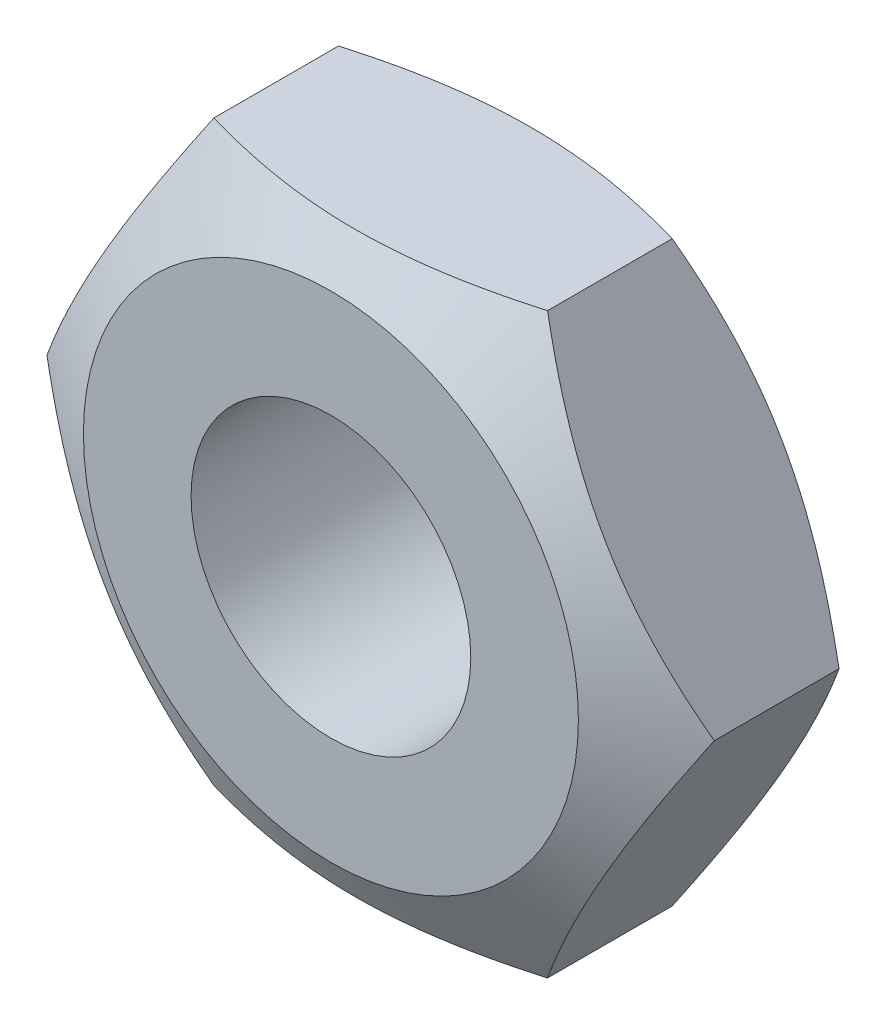
ISO-10303-21;
HEADER;
FILE_DESCRIPTION(('STEP AP214'),'2;1');
FILE_NAME('part.step','',(''),(''),'','','');
FILE_SCHEMA(('AUTOMOTIVE_DESIGN { 1 0 10303 214 1 1 1 1 }'));
ENDSEC;
DATA;
#1=APPLICATION_CONTEXT('core data for automotive mechanical design processes');
#2=APPLICATION_PROTOCOL_DEFINITION('international standard','automotive_design',2000,#1);
#3=PRODUCT_CONTEXT('',#1,'mechanical');
#4=PRODUCT('Part','Part','',(#3));
#5=PRODUCT_RELATED_PRODUCT_CATEGORY('part','',(#4));
#6=PRODUCT_DEFINITION_FORMATION('','',#4);
#7=PRODUCT_DEFINITION_CONTEXT('part definition',#1,'design');
#8=PRODUCT_DEFINITION('design','',#6,#7);
#9=PRODUCT_DEFINITION_SHAPE('','',#8);
#10=(LENGTH_UNIT() NAMED_UNIT(*) SI_UNIT(.MILLI.,.METRE.));
#11=(NAMED_UNIT(*) PLANE_ANGLE_UNIT() SI_UNIT($,.RADIAN.));
#12=(NAMED_UNIT(*) SI_UNIT($,.STERADIAN.) SOLID_ANGLE_UNIT());
#13=UNCERTAINTY_MEASURE_WITH_UNIT(LENGTH_MEASURE(1.E-05),#10,'distance_accuracy_value','');
#14=(GEOMETRIC_REPRESENTATION_CONTEXT(3) GLOBAL_UNCERTAINTY_ASSIGNED_CONTEXT((#13)) GLOBAL_UNIT_ASSIGNED_CONTEXT((#10,
#11,#12)) REPRESENTATION_CONTEXT('',''));
#15=CARTESIAN_POINT('',(0.,0.,0.));
#16=DIRECTION('',(0.,0.,1.));
#17=DIRECTION('',(1.,0.,0.));
#18=AXIS2_PLACEMENT_3D('',#15,#16,#17);
#19=CARTESIAN_POINT('',(4.12159222626818,7.13740000000002,5.5372));
#20=DIRECTION('',(-8.53645842069185E-05,-0.999999996356444,0.));
#21=DIRECTION('',(0.999999996356444,-8.53645842069185E-05,0.));
#22=AXIS2_PLACEMENT_3D('',#19,#20,#21);
#23=PLANE('',#22);
#24=DIRECTION('',(0.,0.,-1.));
#25=VECTOR('',#24,1.);
#26=CARTESIAN_POINT('',(-4.12037360383698,7.13810357198872,5.5372));
#27=LINE('',#26,#25);
#28=CARTESIAN_POINT('',(-4.12037360383698,7.13810357198872,4.30788823694096));
#29=VERTEX_POINT('',#28);
#30=CARTESIAN_POINT('',(-4.12037360383698,7.13810357198872,1.22931176305904));
#31=VERTEX_POINT('',#30);
#32=EDGE_CURVE('E12',#29,#31,#27,.T.);
#33=ORIENTED_EDGE('',*,*,#32,.F.);
#34=CARTESIAN_POINT('',(-4.12057360383698,7.13810358906163,4.30783050086309));
#35=CARTESIAN_POINT('',(-3.93940618814811,7.13808812378047,4.36012084239552));
#36=CARTESIAN_POINT('',(-3.75756329305724,7.13807260083728,4.41003802381626));
#37=CARTESIAN_POINT('',(-3.39240074747005,7.13804142888829,4.50447245527827));
#38=CARTESIAN_POINT('',(-3.20908049601503,7.13802577983119,4.54898737586447));
#39=CARTESIAN_POINT('',(-2.65618459196072,7.13797858210206,4.67355497423284));
#40=CARTESIAN_POINT('',(-2.28442648345868,7.13794684712559,4.74440745196884));
#41=CARTESIAN_POINT('',(-1.72809724572004,7.13789935631135,4.82749006275644));
#42=CARTESIAN_POINT('',(-1.54518834059672,7.13788374236866,4.85115784031085));
#43=CARTESIAN_POINT('',(-1.17854408079075,7.13785244393376,4.89084512282695));
#44=CARTESIAN_POINT('',(-0.99480880057728,7.1378367594479,4.9068653035479));
#45=CARTESIAN_POINT('',(-0.627019148887235,7.1378053632371,4.93084911357203));
#46=CARTESIAN_POINT('',(-0.442965378062387,7.13778965156342,4.93882188592092));
#47=CARTESIAN_POINT('',(-0.0746980003543589,7.13775821457173,4.94654847654521));
#48=CARTESIAN_POINT('',(0.109515601414909,7.13774248925415,4.94630254874227));
#49=CARTESIAN_POINT('',(0.614195268587605,7.13769940748405,4.9343318324784));
#50=CARTESIAN_POINT('',(0.934496113069487,7.13767206513554,4.91423785959537));
#51=CARTESIAN_POINT('',(1.57297040082365,7.13761756204324,4.85052091865647));
#52=CARTESIAN_POINT('',(1.89114159885032,7.13759040149112,4.80687617461222));
#53=CARTESIAN_POINT('',(2.53090070928881,7.13753578872046,4.69777745894697));
#54=CARTESIAN_POINT('',(2.85240790026281,7.13750834339269,4.63186126866467));
#55=CARTESIAN_POINT('',(3.49062782922432,7.13745386201362,4.48225829582427));
#56=CARTESIAN_POINT('',(3.80734874006775,7.13742682526466,4.39860665211493));
#57=CARTESIAN_POINT('',(4.12179222626818,7.1373999829271,4.30783050086309));
#58=B_SPLINE_CURVE_WITH_KNOTS('',3,(#34,#35,#36,#37,#38,#39,#40,#41,#42,#43,#44,#45,#46,#47,#48,
#49,#50,#51,#52,#53,#54,#55,#56,#57),.UNSPECIFIED.,.F.,.F.,(4,2,2,2,2,2,2,2,2,2,2,4),(0.,
0.565643092643378,1.13152923045879,2.26565285271858,2.81882514336941,3.37194854539139,
3.92444280767717,4.47692000033753,5.438702412708,6.40137565540389,7.38539910774354,
8.36749085782236),.UNSPECIFIED.);
#59=CARTESIAN_POINT('',(4.12159222626818,7.13740000000002,4.30788823694096));
#60=VERTEX_POINT('',#59);
#61=EDGE_CURVE('E90',#29,#60,#58,.T.);
#62=ORIENTED_EDGE('',*,*,#61,.T.);
#63=DIRECTION('',(0.,0.,-1.));
#64=VECTOR('',#63,1.);
#65=CARTESIAN_POINT('',(4.12159222626818,7.13740000000002,5.5372));
#66=LINE('',#65,#64);
#67=CARTESIAN_POINT('',(4.12159222626818,7.13740000000002,1.22931176305904));
#68=VERTEX_POINT('',#67);
#69=EDGE_CURVE('E60',#60,#68,#66,.T.);
#70=ORIENTED_EDGE('',*,*,#69,.T.);
#71=CARTESIAN_POINT('',(-4.12057360383698,7.13810358906163,1.22936949913691));
#72=CARTESIAN_POINT('',(-3.93940618814811,7.13808812378047,1.17707915760448));
#73=CARTESIAN_POINT('',(-3.75756329305724,7.13807260083728,1.12716197618374));
#74=CARTESIAN_POINT('',(-3.39240074747005,7.13804142888829,1.03272754472173));
#75=CARTESIAN_POINT('',(-3.20908049601503,7.13802577983119,0.988212624135528));
#76=CARTESIAN_POINT('',(-2.65618459196072,7.13797858210206,0.863645025767163));
#77=CARTESIAN_POINT('',(-2.28442648345868,7.13794684712559,0.792792548031163));
#78=CARTESIAN_POINT('',(-1.72809724572004,7.13789935631135,0.709709937243557));
#79=CARTESIAN_POINT('',(-1.54518834059672,7.13788374236866,0.686042159689147));
#80=CARTESIAN_POINT('',(-1.17854408079075,7.13785244393376,0.646354877173052));
#81=CARTESIAN_POINT('',(-0.99480880057728,7.1378367594479,0.630334696452105));
#82=CARTESIAN_POINT('',(-0.627019148887236,7.1378053632371,0.606350886427972));
#83=CARTESIAN_POINT('',(-0.442965378062388,7.13778965156342,0.598378114079084));
#84=CARTESIAN_POINT('',(-0.0746980003543593,7.13775821457173,0.590651523454793));
#85=CARTESIAN_POINT('',(0.109515601414909,7.13774248925415,0.590897451257725));
#86=CARTESIAN_POINT('',(0.614195268587605,7.13769940748405,0.602868167521598));
#87=CARTESIAN_POINT('',(0.934496113069487,7.13767206513554,0.622962140404627));
#88=CARTESIAN_POINT('',(1.57297040082365,7.13761756204324,0.686679081343524));
#89=CARTESIAN_POINT('',(1.89114159885032,7.13759040149112,0.730323825387775));
#90=CARTESIAN_POINT('',(2.53090070928881,7.13753578872046,0.839422541053031));
#91=CARTESIAN_POINT('',(2.85240790026281,7.13750834339269,0.905338731335329));
#92=CARTESIAN_POINT('',(3.49062782922432,7.13745386201362,1.05494170417573));
#93=CARTESIAN_POINT('',(3.80734874006775,7.13742682526466,1.13859334788507));
#94=CARTESIAN_POINT('',(4.12179222626818,7.1373999829271,1.22936949913691));
#95=B_SPLINE_CURVE_WITH_KNOTS('',3,(#71,#72,#73,#74,#75,#76,#77,#78,#79,#80,#81,#82,#83,#84,#85,
#86,#87,#88,#89,#90,#91,#92,#93,#94),.UNSPECIFIED.,.F.,.F.,(4,2,2,2,2,2,2,2,2,2,2,4),(0.,
0.565643092643377,1.13152923045879,2.26565285271858,2.81882514336941,3.37194854539139,
3.92444280767717,4.47692000033753,5.438702412708,6.40137565540389,7.38539910774354,
8.36749085782236),.UNSPECIFIED.);
#96=EDGE_CURVE('E105',#31,#68,#95,.T.);
#97=ORIENTED_EDGE('',*,*,#96,.F.);
#98=EDGE_LOOP('',(#33,#62,#70,#97));
#99=FACE_BOUND('',#98,.T.);
#100=ADVANCED_FACE('F37',(#99),#23,.F.);
#101=CARTESIAN_POINT('',(-4.12037360383698,7.13810357198872,5.5372));
#102=DIRECTION('',(0.865982718336923,-0.500073926076728,0.));
#103=DIRECTION('',(0.500073926076728,0.865982718336923,0.));
#104=AXIS2_PLACEMENT_3D('',#101,#102,#103);
#105=PLANE('',#104);
#106=DIRECTION('',(0.,0.,-1.));
#107=VECTOR('',#106,1.);
#108=CARTESIAN_POINT('',(-8.24196583010516,0.000703571988696326,5.5372));
#109=LINE('',#108,#107);
#110=CARTESIAN_POINT('',(-8.24196583010516,0.000703571988696322,4.30788823694096));
#111=VERTEX_POINT('',#110);
#112=CARTESIAN_POINT('',(-8.24196583010516,0.000703571988696415,1.22931176305904));
#113=VERTEX_POINT('',#112);
#114=EDGE_CURVE('E45',#111,#113,#109,.T.);
#115=ORIENTED_EDGE('',*,*,#114,.F.);
#116=CARTESIAN_POINT('',(-8.24208132292401,0.000503571988696059,4.30782156558708));
#117=CARTESIAN_POINT('',(-8.15148409142813,0.157391649357806,4.36011227679419));
#118=CARTESIAN_POINT('',(-8.06054906965497,0.314864681325208,4.41002983682875));
#119=CARTESIAN_POINT('',(-7.87794053652239,0.631089594618148,4.50446504195507));
#120=CARTESIAN_POINT('',(-7.78626672463784,0.789841996365864,4.54898035759713));
#121=CARTESIAN_POINT('',(-7.50977748185588,1.26864101701007,4.67354916871746));
#122=CARTESIAN_POINT('',(-7.32387065552509,1.59057761563735,4.74440248507118));
#123=CARTESIAN_POINT('',(-7.04566447336461,2.07234987634206,4.82748634545603));
#124=CARTESIAN_POINT('',(-6.95419636407978,2.23074606096429,4.85115453172131));
#125=CARTESIAN_POINT('',(-6.77084685159904,2.54825413515942,4.89084262777208));
#126=CARTESIAN_POINT('',(-6.6789654856441,2.70736596024178,4.90686321332019));
#127=CARTESIAN_POINT('',(-6.49504317751791,3.02586595004025,4.93084781862488));
#128=CARTESIAN_POINT('',(-6.40300253573183,3.18525359457655,4.93882098158994));
#129=CARTESIAN_POINT('',(-6.21884131371931,3.50416731379769,4.94654833008856));
#130=CARTESIAN_POINT('',(-6.12672073605035,3.66369338405374,4.94630276953199));
#131=CARTESIAN_POINT('',(-5.87434113951377,4.10074150367113,4.9343329173484));
#132=CARTESIAN_POINT('',(-5.71416473796686,4.37812048384163,4.91423909336681));
#133=CARTESIAN_POINT('',(-5.3948758117313,4.93103611862705,4.85052174977164));
#134=CARTESIAN_POINT('',(-5.23576440990609,5.2065708287688,4.80687645256949));
#135=CARTESIAN_POINT('',(-4.91583293113429,5.76059917782102,4.69777601034158));
#136=CARTESIAN_POINT('',(-4.75505322289479,6.03902290986197,4.63185862444789));
#137=CARTESIAN_POINT('',(-4.43589146689861,6.5917183227485,4.48225280608254));
#138=CARTESIAN_POINT('',(-4.27750533182939,6.86599708163159,4.39859951471614));
#139=CARTESIAN_POINT('',(-4.12025811101813,7.13830357198872,4.30782156558708));
#140=B_SPLINE_CURVE_WITH_KNOTS('',3,(#116,#117,#118,#119,#120,#121,#122,#123,#124,#125,#126,
#127,#128,#129,#130,#131,#132,#133,#134,#135,#136,#137,#138,#139),.UNSPECIFIED.,.F.,.F.,(4,2,2,
2,2,2,2,2,2,2,2,4),(0.,0.565644151526927,1.13153134884938,2.2656571484123,2.81883039756829,
3.37195475779125,3.9244499670524,4.47692810750022,5.43872421707767,6.40141120861208,
7.38544913724525,8.36755526096864),.UNSPECIFIED.);
#141=EDGE_CURVE('E98',#111,#29,#140,.T.);
#142=ORIENTED_EDGE('',*,*,#141,.T.);
#143=ORIENTED_EDGE('',*,*,#32,.T.);
#144=CARTESIAN_POINT('',(-8.24208132292401,0.000503571988696117,1.22937843441292));
#145=CARTESIAN_POINT('',(-8.15148409142813,0.157391649357807,1.17708772320581));
#146=CARTESIAN_POINT('',(-8.06054906965497,0.314864681325208,1.12717016317125));
#147=CARTESIAN_POINT('',(-7.87794053652239,0.631089594618148,1.03273495804492));
#148=CARTESIAN_POINT('',(-7.78626672463784,0.789841996365864,0.988219642402865));
#149=CARTESIAN_POINT('',(-7.50977748185588,1.26864101701007,0.863650831282538));
#150=CARTESIAN_POINT('',(-7.32387065552508,1.59057761563735,0.792797514928821));
#151=CARTESIAN_POINT('',(-7.04566447336461,2.07234987634206,0.709713654543974));
#152=CARTESIAN_POINT('',(-6.95419636407978,2.23074606096429,0.686045468278691));
#153=CARTESIAN_POINT('',(-6.77084685159904,2.54825413515942,0.646357372227925));
#154=CARTESIAN_POINT('',(-6.6789654856441,2.70736596024178,0.630336786679808));
#155=CARTESIAN_POINT('',(-6.49504317751791,3.02586595004025,0.606352181375122));
#156=CARTESIAN_POINT('',(-6.40300253573183,3.18525359457655,0.598379018410062));
#157=CARTESIAN_POINT('',(-6.21884131371931,3.50416731379769,0.59065166991144));
#158=CARTESIAN_POINT('',(-6.12672073605035,3.66369338405374,0.590897230468007));
#159=CARTESIAN_POINT('',(-5.87434113951377,4.10074150367113,0.602867082651604));
#160=CARTESIAN_POINT('',(-5.71416473796686,4.37812048384163,0.622960906633185));
#161=CARTESIAN_POINT('',(-5.3948758117313,4.93103611862705,0.686678250228364));
#162=CARTESIAN_POINT('',(-5.23576440990609,5.2065708287688,0.73032354743051));
#163=CARTESIAN_POINT('',(-4.91583293113429,5.76059917782102,0.83942398965842));
#164=CARTESIAN_POINT('',(-4.7550532228948,6.03902290986197,0.905341375552106));
#165=CARTESIAN_POINT('',(-4.43589146689861,6.5917183227485,1.05494719391746));
#166=CARTESIAN_POINT('',(-4.27750533182939,6.86599708163159,1.13860048528385));
#167=CARTESIAN_POINT('',(-4.12025811101813,7.13830357198872,1.22937843441292));
#168=B_SPLINE_CURVE_WITH_KNOTS('',3,(#144,#145,#146,#147,#148,#149,#150,#151,#152,#153,#154,
#155,#156,#157,#158,#159,#160,#161,#162,#163,#164,#165,#166,#167),.UNSPECIFIED.,.F.,.F.,(4,2,2,
2,2,2,2,2,2,2,2,4),(0.,0.565644151526927,1.13153134884938,2.2656571484123,2.81883039756829,
3.37195475779125,3.9244499670524,4.47692810750022,5.43872421707767,6.40141120861208,
7.38544913724525,8.36755526096864),.UNSPECIFIED.);
#169=EDGE_CURVE('E109',#113,#31,#168,.T.);
#170=ORIENTED_EDGE('',*,*,#169,.F.);
#171=EDGE_LOOP('',(#115,#142,#143,#170));
#172=FACE_BOUND('',#171,.T.);
#173=ADVANCED_FACE('F138',(#172),#105,.F.);
#174=CARTESIAN_POINT('',(-8.24196583010516,0.000703571988696326,5.5372));
#175=DIRECTION('',(0.86606808292113,0.499926070279715,0.));
#176=DIRECTION('',(-0.499926070279715,0.86606808292113,0.));
#177=AXIS2_PLACEMENT_3D('',#174,#175,#176);
#178=PLANE('',#177);
#179=DIRECTION('',(0.,0.,-1.));
#180=VECTOR('',#179,1.);
#181=CARTESIAN_POINT('',(-4.12159222626818,-7.13740000000002,5.5372));
#182=LINE('',#181,#180);
#183=CARTESIAN_POINT('',(-4.12159222626818,-7.13740000000002,4.30788823694096));
#184=VERTEX_POINT('',#183);
#185=CARTESIAN_POINT('',(-4.12159222626818,-7.13740000000002,1.22931176305904));
#186=VERTEX_POINT('',#185);
#187=EDGE_CURVE('E118',#184,#186,#182,.T.);
#188=ORIENTED_EDGE('',*,*,#187,.F.);
#189=CARTESIAN_POINT('',(-4.12147677897711,-7.13760000000002,4.30782157215873));
#190=CARTESIAN_POINT('',(-4.2120472236859,-6.9806964574935,4.36011228309395));
#191=CARTESIAN_POINT('',(-4.30295535879776,-6.82320790272737,4.41002984285005));
#192=CARTESIAN_POINT('',(-4.4855099002581,-6.50695181777735,4.50446504740737));
#193=CARTESIAN_POINT('',(-4.57715660704286,-6.34818376711998,4.54898036275888));
#194=CARTESIAN_POINT('',(-4.85356410053077,-5.86933754920587,4.67354917298726));
#195=CARTESIAN_POINT('',(-5.03941595997222,-5.54736921592066,4.7444024887242));
#196=CARTESIAN_POINT('',(-5.31753988518105,-5.06554946488159,4.82748634819001));
#197=CARTESIAN_POINT('',(-5.40898095018502,-4.90713766646519,4.8511545341547));
#198=CARTESIAN_POINT('',(-5.59227625190039,-4.58959829414107,4.89084262960713));
#199=CARTESIAN_POINT('',(-5.68413045138184,-4.43047078473024,4.90686321485751));
#200=CARTESIAN_POINT('',(-5.86799837937434,-4.11193939904346,4.93084781957729));
#201=CARTESIAN_POINT('',(-5.96001180758906,-3.95253604299857,4.93882098225506));
#202=CARTESIAN_POINT('',(-6.14411857881728,-3.63359088712539,4.94654833019629));
#203=CARTESIAN_POINT('',(-6.23621191927408,-3.47404909172634,4.94630276936963));
#204=CARTESIAN_POINT('',(-6.48851689346707,-3.03695789304465,4.93433291655052));
#205=CARTESIAN_POINT('',(-6.64864593430591,-2.75955157306278,4.91423909245942));
#206=CARTESIAN_POINT('',(-6.96784045369349,-2.20658144023843,4.85052174916038));
#207=CARTESIAN_POINT('',(-7.12690480971084,-1.93101957206069,4.80687645236506));
#208=CARTESIAN_POINT('',(-7.44674169161854,-1.37693661534214,4.69777601140699));
#209=CARTESIAN_POINT('',(-7.607473860739,-1.09848544055938,4.63185862639264));
#210=CARTESIAN_POINT('',(-7.9265412474668,-0.545735551377989,4.48225281012009));
#211=CARTESIAN_POINT('',(-8.08488055117797,-0.271429758244471,4.3985995199655));
#212=CARTESIAN_POINT('',(-8.24208127739623,0.000903571988697267,4.30782157215873));
#213=B_SPLINE_CURVE_WITH_KNOTS('',3,(#189,#190,#191,#192,#193,#194,#195,#196,#197,#198,#199,
#200,#201,#202,#203,#204,#205,#206,#207,#208,#209,#210,#211,#212),.UNSPECIFIED.,.F.,.F.,(4,2,2,
2,2,2,2,2,2,2,2,4),(0.,0.565644150748149,1.13153134729136,2.26565714525293,2.81883039370397,
3.37195475322221,3.92444996178688,4.47692810153763,5.4387242010412,6.40141118246375,
7.38544910045004,8.36755521360205),.UNSPECIFIED.);
#214=EDGE_CURVE('E127',#184,#111,#213,.T.);
#215=ORIENTED_EDGE('',*,*,#214,.T.);
#216=ORIENTED_EDGE('',*,*,#114,.T.);
#217=CARTESIAN_POINT('',(-4.12147677897711,-7.13760000000002,1.22937842784127));
#218=CARTESIAN_POINT('',(-4.2120472236859,-6.9806964574935,1.17708771690605));
#219=CARTESIAN_POINT('',(-4.30295535879776,-6.82320790272737,1.12717015714995));
#220=CARTESIAN_POINT('',(-4.4855099002581,-6.50695181777735,1.03273495259263));
#221=CARTESIAN_POINT('',(-4.57715660704286,-6.34818376711998,0.988219637241121));
#222=CARTESIAN_POINT('',(-4.85356410053077,-5.86933754920587,0.863650827012737));
#223=CARTESIAN_POINT('',(-5.03941595997222,-5.54736921592066,0.792797511275799));
#224=CARTESIAN_POINT('',(-5.31753988518105,-5.06554946488159,0.709713651809992));
#225=CARTESIAN_POINT('',(-5.40898095018502,-4.90713766646519,0.686045465845303));
#226=CARTESIAN_POINT('',(-5.59227625190039,-4.58959829414107,0.646357370392867));
#227=CARTESIAN_POINT('',(-5.68413045138184,-4.43047078473024,0.630336785142488));
#228=CARTESIAN_POINT('',(-5.86799837937435,-4.11193939904346,0.606352180422708));
#229=CARTESIAN_POINT('',(-5.96001180758906,-3.95253604299857,0.598379017744935));
#230=CARTESIAN_POINT('',(-6.14411857881728,-3.6335908871254,0.590651669803707));
#231=CARTESIAN_POINT('',(-6.23621191927408,-3.47404909172634,0.590897230630372));
#232=CARTESIAN_POINT('',(-6.48851689346707,-3.03695789304465,0.602867083449481));
#233=CARTESIAN_POINT('',(-6.64864593430591,-2.75955157306278,0.622960907540579));
#234=CARTESIAN_POINT('',(-6.96784045369349,-2.20658144023843,0.686678250839623));
#235=CARTESIAN_POINT('',(-7.12690480971084,-1.93101957206069,0.730323547634939));
#236=CARTESIAN_POINT('',(-7.44674169161854,-1.37693661534214,0.839423988593012));
#237=CARTESIAN_POINT('',(-7.607473860739,-1.09848544055938,0.905341373607359));
#238=CARTESIAN_POINT('',(-7.9265412474668,-0.545735551377989,1.05494718987991));
#239=CARTESIAN_POINT('',(-8.08488055117797,-0.271429758244471,1.1386004800345));
#240=CARTESIAN_POINT('',(-8.24208127739623,0.000903571988697285,1.22937842784127));
#241=B_SPLINE_CURVE_WITH_KNOTS('',3,(#217,#218,#219,#220,#221,#222,#223,#224,#225,#226,#227,
#228,#229,#230,#231,#232,#233,#234,#235,#236,#237,#238,#239,#240),.UNSPECIFIED.,.F.,.F.,(4,2,2,
2,2,2,2,2,2,2,2,4),(0.,0.565644150748149,1.13153134729136,2.26565714525294,2.81883039370397,
3.37195475322221,3.92444996178688,4.47692810153763,5.4387242010412,6.40141118246375,
7.38544910045004,8.36755521360205),.UNSPECIFIED.);
#242=EDGE_CURVE('E126',#186,#113,#241,.T.);
#243=ORIENTED_EDGE('',*,*,#242,.F.);
#244=EDGE_LOOP('',(#188,#215,#216,#243));
#245=FACE_BOUND('',#244,.T.);
#246=ADVANCED_FACE('F125',(#245),#178,.F.);
#247=CARTESIAN_POINT('',(-4.12159222626818,-7.13740000000002,5.5372));
#248=DIRECTION('',(8.53645842068133E-05,0.999999996356444,0.));
#249=DIRECTION('',(-0.999999996356444,8.53645842068133E-05,0.));
#250=AXIS2_PLACEMENT_3D('',#247,#248,#249);
#251=PLANE('',#250);
#252=DIRECTION('',(0.,0.,-1.));
#253=VECTOR('',#252,1.);
#254=CARTESIAN_POINT('',(4.12037360383698,-7.13810357198872,5.5372));
#255=LINE('',#254,#253);
#256=CARTESIAN_POINT('',(4.12037360383698,-7.13810357198872,4.30788823694096));
#257=VERTEX_POINT('',#256);
#258=CARTESIAN_POINT('',(4.12037360383698,-7.13810357198872,1.22931176305904));
#259=VERTEX_POINT('',#258);
#260=EDGE_CURVE('E107',#257,#259,#255,.T.);
#261=ORIENTED_EDGE('',*,*,#260,.F.);
#262=CARTESIAN_POINT('',(4.12057360383698,-7.13810358906163,4.30783050086309));
#263=CARTESIAN_POINT('',(3.93940618814811,-7.13808812378046,4.36012084239552));
#264=CARTESIAN_POINT('',(3.75756329305724,-7.13807260083728,4.41003802381626));
#265=CARTESIAN_POINT('',(3.39240074747005,-7.13804142888829,4.50447245527827));
#266=CARTESIAN_POINT('',(3.20908049601503,-7.13802577983119,4.54898737586447));
#267=CARTESIAN_POINT('',(2.65618459196072,-7.13797858210206,4.67355497423284));
#268=CARTESIAN_POINT('',(2.28442648345868,-7.13794684712559,4.74440745196884));
#269=CARTESIAN_POINT('',(1.72809724572004,-7.13789935631135,4.82749006275644));
#270=CARTESIAN_POINT('',(1.54518834059672,-7.13788374236866,4.85115784031085));
#271=CARTESIAN_POINT('',(1.17854408079075,-7.13785244393376,4.89084512282695));
#272=CARTESIAN_POINT('',(0.994808800577282,-7.1378367594479,4.9068653035479));
#273=CARTESIAN_POINT('',(0.627019148887237,-7.1378053632371,4.93084911357203));
#274=CARTESIAN_POINT('',(0.44296537806239,-7.13778965156342,4.93882188592092));
#275=CARTESIAN_POINT('',(0.0746980003543614,-7.13775821457173,4.94654847654521));
#276=CARTESIAN_POINT('',(-0.109515601414907,-7.13774248925415,4.94630254874228));
#277=CARTESIAN_POINT('',(-0.614195268587602,-7.13769940748405,4.9343318324784));
#278=CARTESIAN_POINT('',(-0.934496113069484,-7.13767206513554,4.91423785959537));
#279=CARTESIAN_POINT('',(-1.57297040082365,-7.13761756204324,4.85052091865647));
#280=CARTESIAN_POINT('',(-1.89114159885032,-7.13759040149112,4.80687617461223));
#281=CARTESIAN_POINT('',(-2.53090070928881,-7.13753578872046,4.69777745894697));
#282=CARTESIAN_POINT('',(-2.85240790026281,-7.13750834339269,4.63186126866467));
#283=CARTESIAN_POINT('',(-3.49062782922432,-7.13745386201362,4.48225829582427));
#284=CARTESIAN_POINT('',(-3.80734874006774,-7.13742682526466,4.39860665211493));
#285=CARTESIAN_POINT('',(-4.12179222626818,-7.1373999829271,4.30783050086309));
#286=B_SPLINE_CURVE_WITH_KNOTS('',3,(#262,#263,#264,#265,#266,#267,#268,#269,#270,#271,#272,
#273,#274,#275,#276,#277,#278,#279,#280,#281,#282,#283,#284,#285),.UNSPECIFIED.,.F.,.F.,(4,2,2,
2,2,2,2,2,2,2,2,4),(0.,0.565643092643377,1.13152923045879,2.26565285271858,2.81882514336941,
3.37194854539139,3.92444280767717,4.47692000033753,5.438702412708,6.40137565540389,
7.38539910774354,8.36749085782236),.UNSPECIFIED.);
#287=EDGE_CURVE('E188',#257,#184,#286,.T.);
#288=ORIENTED_EDGE('',*,*,#287,.T.);
#289=ORIENTED_EDGE('',*,*,#187,.T.);
#290=CARTESIAN_POINT('',(4.12057360383698,-7.13810358906163,1.22936949913691));
#291=CARTESIAN_POINT('',(3.93940618814811,-7.13808812378046,1.17707915760448));
#292=CARTESIAN_POINT('',(3.75756329305724,-7.13807260083728,1.12716197618374));
#293=CARTESIAN_POINT('',(3.39240074747005,-7.13804142888829,1.03272754472173));
#294=CARTESIAN_POINT('',(3.20908049601503,-7.13802577983119,0.988212624135528));
#295=CARTESIAN_POINT('',(2.65618459196072,-7.13797858210206,0.863645025767162));
#296=CARTESIAN_POINT('',(2.28442648345868,-7.13794684712559,0.792792548031163));
#297=CARTESIAN_POINT('',(1.72809724572004,-7.13789935631135,0.709709937243556));
#298=CARTESIAN_POINT('',(1.54518834059672,-7.13788374236866,0.686042159689146));
#299=CARTESIAN_POINT('',(1.17854408079075,-7.13785244393376,0.646354877173051));
#300=CARTESIAN_POINT('',(0.99480880057728,-7.1378367594479,0.630334696452105));
#301=CARTESIAN_POINT('',(0.627019148887236,-7.1378053632371,0.606350886427972));
#302=CARTESIAN_POINT('',(0.442965378062388,-7.13778965156342,0.598378114079084));
#303=CARTESIAN_POINT('',(0.0746980003543596,-7.13775821457173,0.590651523454793));
#304=CARTESIAN_POINT('',(-0.109515601414909,-7.13774248925415,0.590897451257724));
#305=CARTESIAN_POINT('',(-0.614195268587604,-7.13769940748405,0.602868167521598));
#306=CARTESIAN_POINT('',(-0.934496113069486,-7.13767206513554,0.622962140404627));
#307=CARTESIAN_POINT('',(-1.57297040082365,-7.13761756204324,0.686679081343524));
#308=CARTESIAN_POINT('',(-1.89114159885032,-7.13759040149112,0.730323825387776));
#309=CARTESIAN_POINT('',(-2.53090070928881,-7.13753578872046,0.839422541053031));
#310=CARTESIAN_POINT('',(-2.85240790026281,-7.13750834339269,0.905338731335329));
#311=CARTESIAN_POINT('',(-3.49062782922432,-7.13745386201362,1.05494170417573));
#312=CARTESIAN_POINT('',(-3.80734874006775,-7.13742682526466,1.13859334788507));
#313=CARTESIAN_POINT('',(-4.12179222626818,-7.1373999829271,1.22936949913691));
#314=B_SPLINE_CURVE_WITH_KNOTS('',3,(#290,#291,#292,#293,#294,#295,#296,#297,#298,#299,#300,
#301,#302,#303,#304,#305,#306,#307,#308,#309,#310,#311,#312,#313),.UNSPECIFIED.,.F.,.F.,(4,2,2,
2,2,2,2,2,2,2,2,4),(0.,0.565643092643377,1.13152923045879,2.26565285271858,2.81882514336941,
3.37194854539139,3.92444280767717,4.47692000033753,5.438702412708,6.40137565540389,
7.38539910774354,8.36749085782236),.UNSPECIFIED.);
#315=EDGE_CURVE('E136',#259,#186,#314,.T.);
#316=ORIENTED_EDGE('',*,*,#315,.F.);
#317=EDGE_LOOP('',(#261,#288,#289,#316));
#318=FACE_BOUND('',#317,.T.);
#319=ADVANCED_FACE('F179',(#318),#251,.F.);
#320=CARTESIAN_POINT('',(4.12037360383698,-7.13810357198872,5.5372));
#321=DIRECTION('',(-0.865982718336923,0.500073926076729,0.));
#322=DIRECTION('',(-0.500073926076729,-0.865982718336923,0.));
#323=AXIS2_PLACEMENT_3D('',#320,#321,#322);
#324=PLANE('',#323);
#325=DIRECTION('',(0.,0.,-1.));
#326=VECTOR('',#325,1.);
#327=CARTESIAN_POINT('',(8.24196583010516,-0.000703571988695459,5.5372));
#328=LINE('',#327,#326);
#329=CARTESIAN_POINT('',(8.24196583010516,-0.000703571988695459,4.30788823694096));
#330=VERTEX_POINT('',#329);
#331=CARTESIAN_POINT('',(8.24196583010516,-0.000703571988695547,1.22931176305904));
#332=VERTEX_POINT('',#331);
#333=EDGE_CURVE('E104',#330,#332,#328,.T.);
#334=ORIENTED_EDGE('',*,*,#333,.F.);
#335=CARTESIAN_POINT('',(8.24208132292401,-0.00050357198869525,4.30782156558708));
#336=CARTESIAN_POINT('',(8.15148409142813,-0.157391649357806,4.36011227679419));
#337=CARTESIAN_POINT('',(8.06054906965498,-0.314864681325208,4.41002983682875));
#338=CARTESIAN_POINT('',(7.87794053652239,-0.631089594618147,4.50446504195507));
#339=CARTESIAN_POINT('',(7.78626672463784,-0.789841996365863,4.54898035759713));
#340=CARTESIAN_POINT('',(7.50977748185588,-1.26864101701007,4.67354916871746));
#341=CARTESIAN_POINT('',(7.32387065552509,-1.59057761563735,4.74440248507118));
#342=CARTESIAN_POINT('',(7.04566447336461,-2.07234987634206,4.82748634545603));
#343=CARTESIAN_POINT('',(6.95419636407978,-2.23074606096429,4.85115453172131));
#344=CARTESIAN_POINT('',(6.77084685159904,-2.54825413515942,4.89084262777208));
#345=CARTESIAN_POINT('',(6.6789654856441,-2.70736596024178,4.90686321332019));
#346=CARTESIAN_POINT('',(6.49504317751791,-3.02586595004025,4.93084781862488));
#347=CARTESIAN_POINT('',(6.40300253573183,-3.18525359457655,4.93882098158994));
#348=CARTESIAN_POINT('',(6.21884131371931,-3.50416731379769,4.94654833008856));
#349=CARTESIAN_POINT('',(6.12672073605035,-3.66369338405373,4.94630276953199));
#350=CARTESIAN_POINT('',(5.87434113951378,-4.10074150367113,4.9343329173484));
#351=CARTESIAN_POINT('',(5.71416473796686,-4.37812048384163,4.91423909336681));
#352=CARTESIAN_POINT('',(5.3948758117313,-4.93103611862705,4.85052174977164));
#353=CARTESIAN_POINT('',(5.23576440990609,-5.2065708287688,4.80687645256949));
#354=CARTESIAN_POINT('',(4.91583293113429,-5.76059917782102,4.69777601034158));
#355=CARTESIAN_POINT('',(4.7550532228948,-6.03902290986197,4.6318586244479));
#356=CARTESIAN_POINT('',(4.43589146689861,-6.5917183227485,4.48225280608254));
#357=CARTESIAN_POINT('',(4.27750533182939,-6.86599708163159,4.39859951471615));
#358=CARTESIAN_POINT('',(4.12025811101813,-7.13830357198872,4.30782156558708));
#359=B_SPLINE_CURVE_WITH_KNOTS('',3,(#335,#336,#337,#338,#339,#340,#341,#342,#343,#344,#345,
#346,#347,#348,#349,#350,#351,#352,#353,#354,#355,#356,#357,#358),.UNSPECIFIED.,.F.,.F.,(4,2,2,
2,2,2,2,2,2,2,2,4),(0.,0.565644151526928,1.13153134884938,2.2656571484123,2.81883039756829,
3.37195475779125,3.9244499670524,4.47692810750022,5.43872421707767,6.40141120861208,
7.38544913724525,8.36755526096864),.UNSPECIFIED.);
#360=EDGE_CURVE('E52',#330,#257,#359,.T.);
#361=ORIENTED_EDGE('',*,*,#360,.T.);
#362=ORIENTED_EDGE('',*,*,#260,.T.);
#363=CARTESIAN_POINT('',(8.24208132292401,-0.00050357198869525,1.22937843441292));
#364=CARTESIAN_POINT('',(8.15148409142813,-0.157391649357806,1.17708772320581));
#365=CARTESIAN_POINT('',(8.06054906965498,-0.314864681325208,1.12717016317125));
#366=CARTESIAN_POINT('',(7.87794053652239,-0.631089594618147,1.03273495804493));
#367=CARTESIAN_POINT('',(7.78626672463784,-0.789841996365863,0.988219642402866));
#368=CARTESIAN_POINT('',(7.50977748185588,-1.26864101701007,0.863650831282538));
#369=CARTESIAN_POINT('',(7.32387065552509,-1.59057761563735,0.792797514928822));
#370=CARTESIAN_POINT('',(7.04566447336461,-2.07234987634206,0.709713654543974));
#371=CARTESIAN_POINT('',(6.95419636407979,-2.23074606096429,0.686045468278691));
#372=CARTESIAN_POINT('',(6.77084685159904,-2.54825413515942,0.646357372227925));
#373=CARTESIAN_POINT('',(6.6789654856441,-2.70736596024178,0.630336786679807));
#374=CARTESIAN_POINT('',(6.49504317751791,-3.02586595004025,0.606352181375122));
#375=CARTESIAN_POINT('',(6.40300253573183,-3.18525359457655,0.598379018410063));
#376=CARTESIAN_POINT('',(6.21884131371931,-3.50416731379769,0.59065166991144));
#377=CARTESIAN_POINT('',(6.12672073605035,-3.66369338405373,0.590897230468006));
#378=CARTESIAN_POINT('',(5.87434113951378,-4.10074150367113,0.602867082651603));
#379=CARTESIAN_POINT('',(5.71416473796686,-4.37812048384163,0.622960906633185));
#380=CARTESIAN_POINT('',(5.3948758117313,-4.93103611862705,0.686678250228365));
#381=CARTESIAN_POINT('',(5.23576440990609,-5.2065708287688,0.73032354743051));
#382=CARTESIAN_POINT('',(4.91583293113429,-5.76059917782102,0.839423989658419));
#383=CARTESIAN_POINT('',(4.7550532228948,-6.03902290986197,0.905341375552105));
#384=CARTESIAN_POINT('',(4.43589146689861,-6.5917183227485,1.05494719391746));
#385=CARTESIAN_POINT('',(4.27750533182939,-6.86599708163159,1.13860048528385));
#386=CARTESIAN_POINT('',(4.12025811101813,-7.13830357198872,1.22937843441292));
#387=B_SPLINE_CURVE_WITH_KNOTS('',3,(#363,#364,#365,#366,#367,#368,#369,#370,#371,#372,#373,
#374,#375,#376,#377,#378,#379,#380,#381,#382,#383,#384,#385,#386),.UNSPECIFIED.,.F.,.F.,(4,2,2,
2,2,2,2,2,2,2,2,4),(0.,0.565644151526928,1.13153134884938,2.2656571484123,2.81883039756829,
3.37195475779125,3.9244499670524,4.47692810750022,5.43872421707767,6.40141120861208,
7.38544913724525,8.36755526096864),.UNSPECIFIED.);
#388=EDGE_CURVE('E170',#332,#259,#387,.T.);
#389=ORIENTED_EDGE('',*,*,#388,.F.);
#390=EDGE_LOOP('',(#334,#361,#362,#389));
#391=FACE_BOUND('',#390,.T.);
#392=ADVANCED_FACE('F182',(#391),#324,.F.);
#393=CARTESIAN_POINT('',(8.24196583010516,-0.000703571988695459,5.5372));
#394=DIRECTION('',(-0.86606808292113,-0.499926070279716,0.));
#395=DIRECTION('',(0.499926070279716,-0.86606808292113,0.));
#396=AXIS2_PLACEMENT_3D('',#393,#394,#395);
#397=PLANE('',#396);
#398=ORIENTED_EDGE('',*,*,#69,.F.);
#399=CARTESIAN_POINT('',(4.12147677897711,7.13760000000002,4.30782157215873));
#400=CARTESIAN_POINT('',(4.2120472236859,6.9806964574935,4.36011228309395));
#401=CARTESIAN_POINT('',(4.30295535879776,6.82320790272737,4.41002984285005));
#402=CARTESIAN_POINT('',(4.48550990025811,6.50695181777735,4.50446504740737));
#403=CARTESIAN_POINT('',(4.57715660704286,6.34818376711999,4.54898036275888));
#404=CARTESIAN_POINT('',(4.85356410053077,5.86933754920587,4.67354917298726));
#405=CARTESIAN_POINT('',(5.03941595997222,5.54736921592066,4.7444024887242));
#406=CARTESIAN_POINT('',(5.31753988518106,5.06554946488158,4.82748634819001));
#407=CARTESIAN_POINT('',(5.40898095018502,4.90713766646519,4.85115453415469));
#408=CARTESIAN_POINT('',(5.5922762519004,4.58959829414107,4.89084262960713));
#409=CARTESIAN_POINT('',(5.68413045138185,4.43047078473024,4.90686321485751));
#410=CARTESIAN_POINT('',(5.86799837937435,4.11193939904346,4.93084781957729));
#411=CARTESIAN_POINT('',(5.96001180758906,3.95253604299857,4.93882098225506));
#412=CARTESIAN_POINT('',(6.14411857881729,3.6335908871254,4.94654833019629));
#413=CARTESIAN_POINT('',(6.23621191927408,3.47404909172634,4.94630276936963));
#414=CARTESIAN_POINT('',(6.48851689346707,3.03695789304465,4.93433291655052));
#415=CARTESIAN_POINT('',(6.64864593430591,2.75955157306278,4.91423909245942));
#416=CARTESIAN_POINT('',(6.96784045369349,2.20658144023843,4.85052174916038));
#417=CARTESIAN_POINT('',(7.12690480971085,1.93101957206069,4.80687645236506));
#418=CARTESIAN_POINT('',(7.44674169161854,1.37693661534214,4.69777601140699));
#419=CARTESIAN_POINT('',(7.607473860739,1.09848544055938,4.63185862639264));
#420=CARTESIAN_POINT('',(7.9265412474668,0.545735551377991,4.48225281012009));
#421=CARTESIAN_POINT('',(8.08488055117797,0.271429758244473,4.3985995199655));
#422=CARTESIAN_POINT('',(8.24208127739623,-0.000903571988696104,4.30782157215872));
#423=B_SPLINE_CURVE_WITH_KNOTS('',3,(#399,#400,#401,#402,#403,#404,#405,#406,#407,#408,#409,
#410,#411,#412,#413,#414,#415,#416,#417,#418,#419,#420,#421,#422),.UNSPECIFIED.,.F.,.F.,(4,2,2,
2,2,2,2,2,2,2,2,4),(0.,0.565644150748148,1.13153134729136,2.26565714525294,2.81883039370397,
3.37195475322221,3.92444996178688,4.47692810153763,5.4387242010412,6.40141118246375,
7.38544910045004,8.36755521360205),.UNSPECIFIED.);
#424=EDGE_CURVE('E88',#60,#330,#423,.T.);
#425=ORIENTED_EDGE('',*,*,#424,.T.);
#426=ORIENTED_EDGE('',*,*,#333,.T.);
#427=CARTESIAN_POINT('',(4.12147677897711,7.13760000000002,1.22937842784127));
#428=CARTESIAN_POINT('',(4.2120472236859,6.9806964574935,1.17708771690605));
#429=CARTESIAN_POINT('',(4.30295535879776,6.82320790272737,1.12717015714995));
#430=CARTESIAN_POINT('',(4.48550990025811,6.50695181777735,1.03273495259263));
#431=CARTESIAN_POINT('',(4.57715660704286,6.34818376711999,0.988219637241122));
#432=CARTESIAN_POINT('',(4.85356410053077,5.86933754920587,0.863650827012737));
#433=CARTESIAN_POINT('',(5.03941595997222,5.54736921592066,0.792797511275799));
#434=CARTESIAN_POINT('',(5.31753988518106,5.06554946488159,0.709713651809993));
#435=CARTESIAN_POINT('',(5.40898095018502,4.90713766646519,0.686045465845304));
#436=CARTESIAN_POINT('',(5.5922762519004,4.58959829414107,0.646357370392868));
#437=CARTESIAN_POINT('',(5.68413045138185,4.43047078473024,0.630336785142489));
#438=CARTESIAN_POINT('',(5.86799837937435,4.11193939904346,0.60635218042271));
#439=CARTESIAN_POINT('',(5.96001180758906,3.95253604299857,0.598379017744937));
#440=CARTESIAN_POINT('',(6.14411857881729,3.63359088712539,0.590651669803708));
#441=CARTESIAN_POINT('',(6.23621191927408,3.47404909172634,0.590897230630374));
#442=CARTESIAN_POINT('',(6.48851689346707,3.03695789304465,0.602867083449482));
#443=CARTESIAN_POINT('',(6.64864593430591,2.75955157306278,0.622960907540581));
#444=CARTESIAN_POINT('',(6.96784045369349,2.20658144023843,0.686678250839625));
#445=CARTESIAN_POINT('',(7.12690480971085,1.93101957206069,0.730323547634941));
#446=CARTESIAN_POINT('',(7.44674169161854,1.37693661534214,0.839423988593014));
#447=CARTESIAN_POINT('',(7.607473860739,1.09848544055938,0.90534137360736));
#448=CARTESIAN_POINT('',(7.9265412474668,0.54573555137799,1.05494718987991));
#449=CARTESIAN_POINT('',(8.08488055117798,0.271429758244473,1.1386004800345));
#450=CARTESIAN_POINT('',(8.24208127739623,-0.000903571988696564,1.22937842784127));
#451=B_SPLINE_CURVE_WITH_KNOTS('',3,(#427,#428,#429,#430,#431,#432,#433,#434,#435,#436,#437,
#438,#439,#440,#441,#442,#443,#444,#445,#446,#447,#448,#449,#450),.UNSPECIFIED.,.F.,.F.,(4,2,2,
2,2,2,2,2,2,2,2,4),(0.,0.565644150748147,1.13153134729136,2.26565714525294,2.81883039370397,
3.37195475322221,3.92444996178688,4.47692810153763,5.4387242010412,6.40141118246375,
7.38544910045004,8.36755521360205),.UNSPECIFIED.);
#452=EDGE_CURVE('E103',#68,#332,#451,.T.);
#453=ORIENTED_EDGE('',*,*,#452,.F.);
#454=EDGE_LOOP('',(#398,#425,#426,#453));
#455=FACE_BOUND('',#454,.T.);
#456=ADVANCED_FACE('F101',(#455),#397,.F.);
#457=CARTESIAN_POINT('',(0.,0.,0.));
#458=DIRECTION('',(0.,0.,1.));
#459=DIRECTION('',(-1.,0.,0.));
#460=AXIS2_PLACEMENT_3D('',#457,#458,#459);
#461=CONICAL_SURFACE('',#460,6.11273542817488,1.0471975511966);
#462=CARTESIAN_POINT('',(0.,0.,0.));
#463=DIRECTION('',(0.,0.,-1.));
#464=DIRECTION('',(-1.,0.,0.));
#465=AXIS2_PLACEMENT_3D('',#462,#463,#464);
#466=CIRCLE('',#465,6.11273542817488);
#467=CARTESIAN_POINT('',(-6.11273542817488,0.,0.));
#468=VERTEX_POINT('',#467);
#469=EDGE_CURVE('E97',#468,#468,#466,.T.);
#470=ORIENTED_EDGE('',*,*,#469,.F.);
#471=EDGE_LOOP('',(#470));
#472=FACE_BOUND('',#471,.T.);
#473=ORIENTED_EDGE('',*,*,#96,.T.);
#474=ORIENTED_EDGE('',*,*,#452,.T.);
#475=ORIENTED_EDGE('',*,*,#388,.T.);
#476=ORIENTED_EDGE('',*,*,#315,.T.);
#477=ORIENTED_EDGE('',*,*,#242,.T.);
#478=ORIENTED_EDGE('',*,*,#169,.T.);
#479=EDGE_LOOP('',(#473,#474,#475,#476,#477,#478));
#480=FACE_BOUND('',#479,.T.);
#481=ADVANCED_FACE('F133',(#472,#480),#461,.T.);
#482=CARTESIAN_POINT('',(0.,0.,0.));
#483=DIRECTION('',(0.,0.,1.));
#484=DIRECTION('',(1.,0.,0.));
#485=AXIS2_PLACEMENT_3D('',#482,#483,#484);
#486=PLANE('',#485);
#487=CARTESIAN_POINT('',(0.,0.,0.));
#488=DIRECTION('',(0.,0.,1.));
#489=DIRECTION('',(1.,0.,0.));
#490=AXIS2_PLACEMENT_3D('',#487,#488,#489);
#491=CIRCLE('',#490,3.45439999999999);
#492=CARTESIAN_POINT('',(3.45439999999999,0.,0.));
#493=VERTEX_POINT('',#492);
#494=EDGE_CURVE('E287',#493,#493,#491,.T.);
#495=ORIENTED_EDGE('',*,*,#494,.T.);
#496=EDGE_LOOP('',(#495));
#497=FACE_BOUND('',#496,.T.);
#498=ORIENTED_EDGE('',*,*,#469,.T.);
#499=EDGE_LOOP('',(#498));
#500=FACE_BOUND('',#499,.T.);
#501=ADVANCED_FACE('F152',(#497,#500),#486,.F.);
#502=CARTESIAN_POINT('',(0.,0.,5.5372));
#503=DIRECTION('',(0.,0.,-1.));
#504=DIRECTION('',(-1.,0.,0.));
#505=AXIS2_PLACEMENT_3D('',#502,#503,#504);
#506=CONICAL_SURFACE('',#505,6.11273542817488,1.0471975511966);
#507=CARTESIAN_POINT('',(0.,0.,5.5372));
#508=DIRECTION('',(0.,0.,-1.));
#509=DIRECTION('',(-1.,0.,0.));
#510=AXIS2_PLACEMENT_3D('',#507,#508,#509);
#511=CIRCLE('',#510,6.11273542817488);
#512=CARTESIAN_POINT('',(-6.11273542817488,0.,5.5372));
#513=VERTEX_POINT('',#512);
#514=EDGE_CURVE('E94',#513,#513,#511,.T.);
#515=ORIENTED_EDGE('',*,*,#514,.T.);
#516=EDGE_LOOP('',(#515));
#517=FACE_BOUND('',#516,.T.);
#518=ORIENTED_EDGE('',*,*,#141,.F.);
#519=ORIENTED_EDGE('',*,*,#214,.F.);
#520=ORIENTED_EDGE('',*,*,#287,.F.);
#521=ORIENTED_EDGE('',*,*,#360,.F.);
#522=ORIENTED_EDGE('',*,*,#424,.F.);
#523=ORIENTED_EDGE('',*,*,#61,.F.);
#524=EDGE_LOOP('',(#518,#519,#520,#521,#522,#523));
#525=FACE_BOUND('',#524,.T.);
#526=ADVANCED_FACE('F89',(#517,#525),#506,.T.);
#527=CARTESIAN_POINT('',(0.,0.,5.5372));
#528=DIRECTION('',(0.,0.,1.));
#529=DIRECTION('',(1.,0.,0.));
#530=AXIS2_PLACEMENT_3D('',#527,#528,#529);
#531=PLANE('',#530);
#532=CARTESIAN_POINT('',(0.,0.,5.5372));
#533=DIRECTION('',(0.,0.,1.));
#534=DIRECTION('',(1.,0.,0.));
#535=AXIS2_PLACEMENT_3D('',#532,#533,#534);
#536=CIRCLE('',#535,3.45439999999999);
#537=CARTESIAN_POINT('',(3.45439999999999,0.,5.5372));
#538=VERTEX_POINT('',#537);
#539=EDGE_CURVE('E284',#538,#538,#536,.T.);
#540=ORIENTED_EDGE('',*,*,#539,.F.);
#541=EDGE_LOOP('',(#540));
#542=FACE_BOUND('',#541,.T.);
#543=ORIENTED_EDGE('',*,*,#514,.F.);
#544=EDGE_LOOP('',(#543));
#545=FACE_BOUND('',#544,.T.);
#546=ADVANCED_FACE('F156',(#542,#545),#531,.T.);
#547=CARTESIAN_POINT('',(0.,0.,5.5372));
#548=DIRECTION('',(0.,0.,1.));
#549=DIRECTION('',(1.,0.,0.));
#550=AXIS2_PLACEMENT_3D('',#547,#548,#549);
#551=CYLINDRICAL_SURFACE('',#550,3.45439999999999);
#552=ORIENTED_EDGE('',*,*,#539,.T.);
#553=EDGE_LOOP('',(#552));
#554=FACE_BOUND('',#553,.T.);
#555=ORIENTED_EDGE('',*,*,#494,.F.);
#556=EDGE_LOOP('',(#555));
#557=FACE_BOUND('',#556,.T.);
#558=ADVANCED_FACE('F268',(#554,#557),#551,.F.);
#559=CLOSED_SHELL('',(#100,#173,#246,#319,#392,#456,#481,#501,#526,#546,#558));
#560=MANIFOLD_SOLID_BREP('B2',#559);
#561=ADVANCED_BREP_SHAPE_REPRESENTATION('',(#18,#560),#14);
#562=SHAPE_DEFINITION_REPRESENTATION(#9,#561);
ENDSEC;
END-ISO-10303-21;
